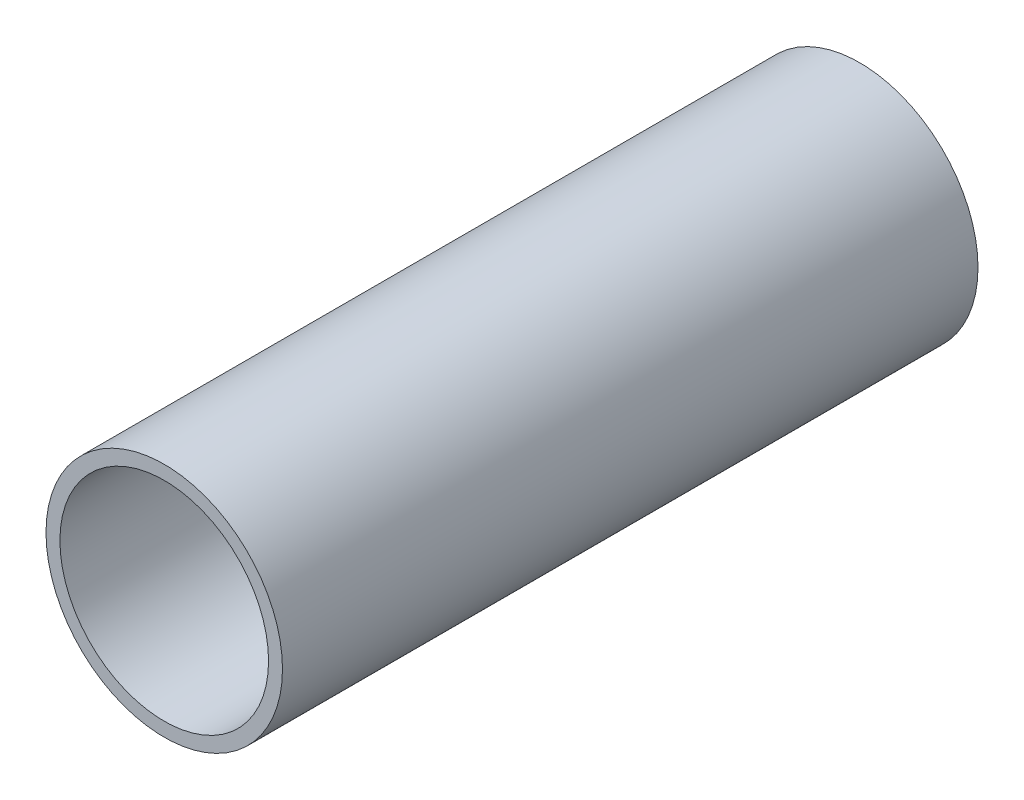
ISO-10303-21;
HEADER;
FILE_DESCRIPTION(('STEP AP214'),'2;1');
FILE_NAME('part.step','',(''),(''),'','','');
FILE_SCHEMA(('AUTOMOTIVE_DESIGN { 1 0 10303 214 1 1 1 1 }'));
ENDSEC;
DATA;
#1=APPLICATION_CONTEXT('core data for automotive mechanical design processes');
#2=APPLICATION_PROTOCOL_DEFINITION('international standard','automotive_design',2000,#1);
#3=PRODUCT_CONTEXT('',#1,'mechanical');
#4=PRODUCT('Part','Part','',(#3));
#5=PRODUCT_RELATED_PRODUCT_CATEGORY('part','',(#4));
#6=PRODUCT_DEFINITION_FORMATION('','',#4);
#7=PRODUCT_DEFINITION_CONTEXT('part definition',#1,'design');
#8=PRODUCT_DEFINITION('design','',#6,#7);
#9=PRODUCT_DEFINITION_SHAPE('','',#8);
#10=(LENGTH_UNIT() NAMED_UNIT(*) SI_UNIT(.MILLI.,.METRE.));
#11=(NAMED_UNIT(*) PLANE_ANGLE_UNIT() SI_UNIT($,.RADIAN.));
#12=(NAMED_UNIT(*) SI_UNIT($,.STERADIAN.) SOLID_ANGLE_UNIT());
#13=UNCERTAINTY_MEASURE_WITH_UNIT(LENGTH_MEASURE(1.E-05),#10,'distance_accuracy_value','');
#14=(GEOMETRIC_REPRESENTATION_CONTEXT(3) GLOBAL_UNCERTAINTY_ASSIGNED_CONTEXT((#13)) GLOBAL_UNIT_ASSIGNED_CONTEXT((#10,
#11,#12)) REPRESENTATION_CONTEXT('',''));
#15=CARTESIAN_POINT('',(0.,0.,0.));
#16=DIRECTION('',(0.,0.,1.));
#17=DIRECTION('',(1.,0.,0.));
#18=AXIS2_PLACEMENT_3D('',#15,#16,#17);
#19=CARTESIAN_POINT('',(0.,0.,50.));
#20=DIRECTION('',(0.,0.,-1.));
#21=DIRECTION('',(-1.,0.,0.));
#22=AXIS2_PLACEMENT_3D('',#19,#20,#21);
#23=CYLINDRICAL_SURFACE('',#22,8.5);
#24=CARTESIAN_POINT('',(0.,0.,50.));
#25=DIRECTION('',(0.,0.,1.));
#26=DIRECTION('',(1.,0.,0.));
#27=AXIS2_PLACEMENT_3D('',#24,#25,#26);
#28=CIRCLE('',#27,8.5);
#29=CARTESIAN_POINT('',(8.5,0.,50.));
#30=VERTEX_POINT('',#29);
#31=EDGE_CURVE('E10',#30,#30,#28,.T.);
#32=ORIENTED_EDGE('',*,*,#31,.F.);
#33=EDGE_LOOP('',(#32));
#34=FACE_BOUND('',#33,.T.);
#35=CARTESIAN_POINT('',(0.,0.,0.));
#36=DIRECTION('',(0.,0.,1.));
#37=DIRECTION('',(1.,0.,0.));
#38=AXIS2_PLACEMENT_3D('',#35,#36,#37);
#39=CIRCLE('',#38,8.5);
#40=CARTESIAN_POINT('',(8.5,0.,0.));
#41=VERTEX_POINT('',#40);
#42=EDGE_CURVE('E40',#41,#41,#39,.T.);
#43=ORIENTED_EDGE('',*,*,#42,.T.);
#44=EDGE_LOOP('',(#43));
#45=FACE_BOUND('',#44,.T.);
#46=ADVANCED_FACE('F37',(#34,#45),#23,.T.);
#47=CARTESIAN_POINT('',(0.,0.,50.));
#48=DIRECTION('',(0.,0.,1.));
#49=DIRECTION('',(1.,0.,0.));
#50=AXIS2_PLACEMENT_3D('',#47,#48,#49);
#51=PLANE('',#50);
#52=CARTESIAN_POINT('',(0.,0.,50.));
#53=DIRECTION('',(0.,0.,1.));
#54=DIRECTION('',(1.,0.,0.));
#55=AXIS2_PLACEMENT_3D('',#52,#53,#54);
#56=CIRCLE('',#55,7.5);
#57=CARTESIAN_POINT('',(7.5,0.,50.));
#58=VERTEX_POINT('',#57);
#59=EDGE_CURVE('E54',#58,#58,#56,.T.);
#60=ORIENTED_EDGE('',*,*,#59,.F.);
#61=EDGE_LOOP('',(#60));
#62=FACE_BOUND('',#61,.T.);
#63=ORIENTED_EDGE('',*,*,#31,.T.);
#64=EDGE_LOOP('',(#63));
#65=FACE_BOUND('',#64,.T.);
#66=ADVANCED_FACE('F62',(#62,#65),#51,.T.);
#67=CARTESIAN_POINT('',(0.,0.,0.));
#68=DIRECTION('',(0.,0.,1.));
#69=DIRECTION('',(1.,0.,0.));
#70=AXIS2_PLACEMENT_3D('',#67,#68,#69);
#71=PLANE('',#70);
#72=CARTESIAN_POINT('',(0.,0.,0.));
#73=DIRECTION('',(0.,0.,1.));
#74=DIRECTION('',(1.,0.,0.));
#75=AXIS2_PLACEMENT_3D('',#72,#73,#74);
#76=CIRCLE('',#75,7.5);
#77=CARTESIAN_POINT('',(7.5,0.,0.));
#78=VERTEX_POINT('',#77);
#79=EDGE_CURVE('E49',#78,#78,#76,.F.);
#80=ORIENTED_EDGE('',*,*,#79,.F.);
#81=EDGE_LOOP('',(#80));
#82=FACE_BOUND('',#81,.T.);
#83=ORIENTED_EDGE('',*,*,#42,.F.);
#84=EDGE_LOOP('',(#83));
#85=FACE_BOUND('',#84,.T.);
#86=ADVANCED_FACE('F64',(#82,#85),#71,.F.);
#87=CARTESIAN_POINT('',(0.,0.,-0.001000000000001));
#88=DIRECTION('',(0.,0.,1.));
#89=DIRECTION('',(1.,0.,0.));
#90=AXIS2_PLACEMENT_3D('',#87,#88,#89);
#91=CYLINDRICAL_SURFACE('',#90,7.5);
#92=ORIENTED_EDGE('',*,*,#59,.T.);
#93=EDGE_LOOP('',(#92));
#94=FACE_BOUND('',#93,.T.);
#95=ORIENTED_EDGE('',*,*,#79,.T.);
#96=EDGE_LOOP('',(#95));
#97=FACE_BOUND('',#96,.T.);
#98=ADVANCED_FACE('F59',(#94,#97),#91,.F.);
#99=CLOSED_SHELL('',(#46,#66,#86,#98));
#100=MANIFOLD_SOLID_BREP('B2',#99);
#101=ADVANCED_BREP_SHAPE_REPRESENTATION('',(#18,#100),#14);
#102=SHAPE_DEFINITION_REPRESENTATION(#9,#101);
ENDSEC;
END-ISO-10303-21;
